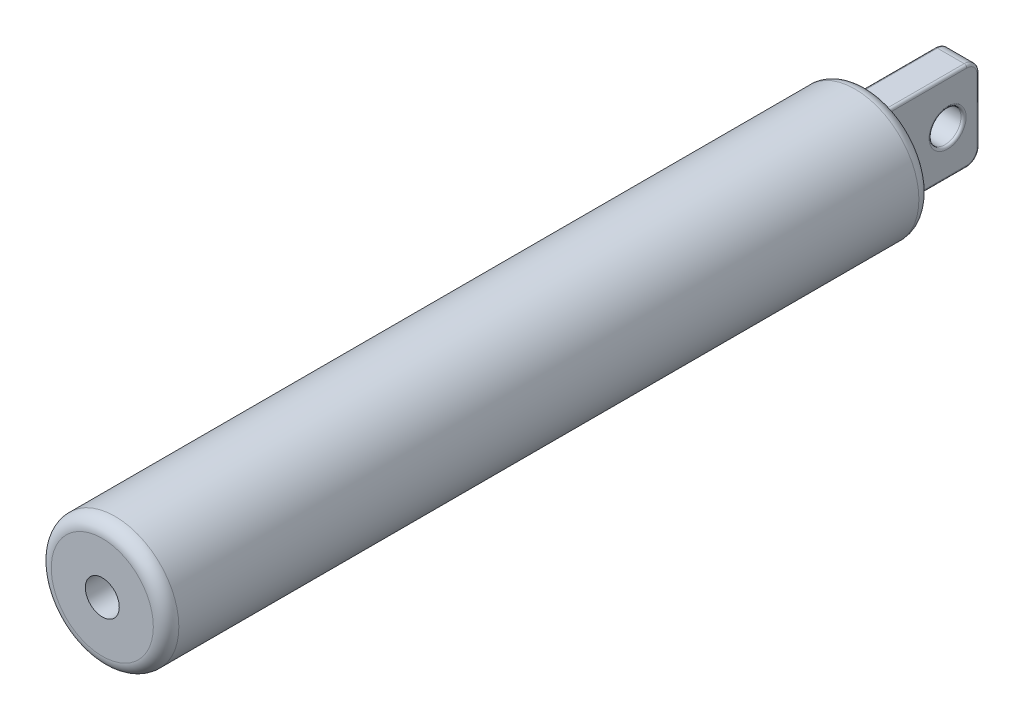
ISO-10303-21;
HEADER;
FILE_DESCRIPTION(('STEP AP214'),'2;1');
FILE_NAME('part.step','',(''),(''),'','','');
FILE_SCHEMA(('AUTOMOTIVE_DESIGN { 1 0 10303 214 1 1 1 1 }'));
ENDSEC;
DATA;
#1=APPLICATION_CONTEXT('core data for automotive mechanical design processes');
#2=APPLICATION_PROTOCOL_DEFINITION('international standard','automotive_design',2000,#1);
#3=PRODUCT_CONTEXT('',#1,'mechanical');
#4=PRODUCT('Part','Part','',(#3));
#5=PRODUCT_RELATED_PRODUCT_CATEGORY('part','',(#4));
#6=PRODUCT_DEFINITION_FORMATION('','',#4);
#7=PRODUCT_DEFINITION_CONTEXT('part definition',#1,'design');
#8=PRODUCT_DEFINITION('design','',#6,#7);
#9=PRODUCT_DEFINITION_SHAPE('','',#8);
#10=(LENGTH_UNIT() NAMED_UNIT(*) SI_UNIT(.MILLI.,.METRE.));
#11=(NAMED_UNIT(*) PLANE_ANGLE_UNIT() SI_UNIT($,.RADIAN.));
#12=(NAMED_UNIT(*) SI_UNIT($,.STERADIAN.) SOLID_ANGLE_UNIT());
#13=UNCERTAINTY_MEASURE_WITH_UNIT(LENGTH_MEASURE(1.E-05),#10,'distance_accuracy_value','');
#14=(GEOMETRIC_REPRESENTATION_CONTEXT(3) GLOBAL_UNCERTAINTY_ASSIGNED_CONTEXT((#13)) GLOBAL_UNIT_ASSIGNED_CONTEXT((#10,
#11,#12)) REPRESENTATION_CONTEXT('',''));
#15=CARTESIAN_POINT('',(0.,0.,0.));
#16=DIRECTION('',(0.,0.,1.));
#17=DIRECTION('',(1.,0.,0.));
#18=AXIS2_PLACEMENT_3D('',#15,#16,#17);
#19=CARTESIAN_POINT('',(0.,0.,0.));
#20=DIRECTION('',(0.,0.,1.));
#21=DIRECTION('',(1.,0.,0.));
#22=AXIS2_PLACEMENT_3D('',#19,#20,#21);
#23=PLANE('',#22);
#24=CARTESIAN_POINT('',(0.,0.,0.));
#25=DIRECTION('',(0.,0.,1.));
#26=DIRECTION('',(1.,0.,0.));
#27=AXIS2_PLACEMENT_3D('',#24,#25,#26);
#28=CIRCLE('',#27,10.16);
#29=CARTESIAN_POINT('',(10.16,0.,0.));
#30=VERTEX_POINT('',#29);
#31=EDGE_CURVE('E182',#30,#30,#28,.F.);
#32=ORIENTED_EDGE('',*,*,#31,.T.);
#33=EDGE_LOOP('',(#32));
#34=FACE_BOUND('',#33,.T.);
#35=CARTESIAN_POINT('',(-2.667,8.382,0.));
#36=DIRECTION('',(0.,0.,1.));
#37=DIRECTION('',(1.,0.,0.));
#38=AXIS2_PLACEMENT_3D('',#35,#36,#37);
#39=CIRCLE('',#38,1.016);
#40=CARTESIAN_POINT('',(-3.683,8.382,0.));
#41=VERTEX_POINT('',#40);
#42=CARTESIAN_POINT('',(-2.667,9.398,0.));
#43=VERTEX_POINT('',#42);
#44=EDGE_CURVE('E210',#41,#43,#39,.F.);
#45=ORIENTED_EDGE('',*,*,#44,.F.);
#46=DIRECTION('',(0.,1.,0.));
#47=VECTOR('',#46,1.);
#48=CARTESIAN_POINT('',(-3.683,-8.89,0.));
#49=LINE('',#48,#47);
#50=CARTESIAN_POINT('',(-3.683,-8.382,0.));
#51=VERTEX_POINT('',#50);
#52=EDGE_CURVE('E208',#41,#51,#49,.F.);
#53=ORIENTED_EDGE('',*,*,#52,.T.);
#54=CARTESIAN_POINT('',(-2.667,-8.382,0.));
#55=DIRECTION('',(0.,0.,1.));
#56=DIRECTION('',(1.,0.,0.));
#57=AXIS2_PLACEMENT_3D('',#54,#55,#56);
#58=CIRCLE('',#57,1.016);
#59=CARTESIAN_POINT('',(-2.667,-9.398,0.));
#60=VERTEX_POINT('',#59);
#61=EDGE_CURVE('E205',#60,#51,#58,.F.);
#62=ORIENTED_EDGE('',*,*,#61,.F.);
#63=DIRECTION('',(-1.,0.,0.));
#64=VECTOR('',#63,1.);
#65=CARTESIAN_POINT('',(3.175,-9.398,0.));
#66=LINE('',#65,#64);
#67=CARTESIAN_POINT('',(2.667,-9.398,0.));
#68=VERTEX_POINT('',#67);
#69=EDGE_CURVE('E200',#60,#68,#66,.F.);
#70=ORIENTED_EDGE('',*,*,#69,.T.);
#71=CARTESIAN_POINT('',(2.667,-8.382,0.));
#72=DIRECTION('',(0.,0.,1.));
#73=DIRECTION('',(1.,0.,0.));
#74=AXIS2_PLACEMENT_3D('',#71,#72,#73);
#75=CIRCLE('',#74,1.016);
#76=CARTESIAN_POINT('',(3.683,-8.382,0.));
#77=VERTEX_POINT('',#76);
#78=EDGE_CURVE('E197',#77,#68,#75,.F.);
#79=ORIENTED_EDGE('',*,*,#78,.F.);
#80=DIRECTION('',(0.,-1.,0.));
#81=VECTOR('',#80,1.);
#82=CARTESIAN_POINT('',(3.683,8.89,0.));
#83=LINE('',#82,#81);
#84=CARTESIAN_POINT('',(3.683,8.382,0.));
#85=VERTEX_POINT('',#84);
#86=EDGE_CURVE('E195',#77,#85,#83,.F.);
#87=ORIENTED_EDGE('',*,*,#86,.T.);
#88=CARTESIAN_POINT('',(2.667,8.382,0.));
#89=DIRECTION('',(0.,0.,1.));
#90=DIRECTION('',(1.,0.,0.));
#91=AXIS2_PLACEMENT_3D('',#88,#89,#90);
#92=CIRCLE('',#91,1.016);
#93=CARTESIAN_POINT('',(2.667,9.398,0.));
#94=VERTEX_POINT('',#93);
#95=EDGE_CURVE('E192',#94,#85,#92,.F.);
#96=ORIENTED_EDGE('',*,*,#95,.F.);
#97=DIRECTION('',(1.,0.,0.));
#98=VECTOR('',#97,1.);
#99=CARTESIAN_POINT('',(-3.175,9.398,0.));
#100=LINE('',#99,#98);
#101=EDGE_CURVE('E202',#94,#43,#100,.F.);
#102=ORIENTED_EDGE('',*,*,#101,.T.);
#103=EDGE_LOOP('',(#45,#53,#62,#70,#79,#87,#96,#102));
#104=FACE_BOUND('',#103,.T.);
#105=ADVANCED_FACE('F32',(#34,#104),#23,.F.);
#106=CARTESIAN_POINT('',(0.,0.,152.4));
#107=DIRECTION('',(0.,0.,-1.));
#108=DIRECTION('',(-1.,0.,0.));
#109=AXIS2_PLACEMENT_3D('',#106,#107,#108);
#110=CYLINDRICAL_SURFACE('',#109,12.7);
#111=CARTESIAN_POINT('',(0.,0.,2.53999999999996));
#112=DIRECTION('',(0.,0.,1.));
#113=DIRECTION('',(1.,0.,0.));
#114=AXIS2_PLACEMENT_3D('',#111,#112,#113);
#115=CIRCLE('',#114,12.7);
#116=CARTESIAN_POINT('',(-12.7,0.,2.53999999999993));
#117=VERTEX_POINT('',#116);
#118=EDGE_CURVE('E179',#117,#117,#115,.T.);
#119=CARTESIAN_POINT('',(0.,0.,149.86));
#120=DIRECTION('',(0.,0.,1.));
#121=DIRECTION('',(1.,0.,0.));
#122=AXIS2_PLACEMENT_3D('',#119,#120,#121);
#123=CIRCLE('',#122,12.7);
#124=CARTESIAN_POINT('',(-12.7,0.,149.86));
#125=VERTEX_POINT('',#124);
#126=EDGE_CURVE('E160',#125,#125,#123,.F.);
#127=CARTESIAN_POINT('',(-12.7,0.,2.53999999999993));
#128=CARTESIAN_POINT('',(-12.7,0.,4.07458333333327));
#129=CARTESIAN_POINT('',(-12.7,0.,5.60916666666661));
#130=CARTESIAN_POINT('',(-12.7,0.,8.67833333333328));
#131=CARTESIAN_POINT('',(-12.7,0.,10.2129166666666));
#132=CARTESIAN_POINT('',(-12.7,0.,13.2820833333333));
#133=CARTESIAN_POINT('',(-12.7,0.,14.8166666666666));
#134=CARTESIAN_POINT('',(-12.7,0.,17.8858333333333));
#135=CARTESIAN_POINT('',(-12.7,0.,19.4204166666666));
#136=CARTESIAN_POINT('',(-12.7,0.,22.4895833333333));
#137=CARTESIAN_POINT('',(-12.7,0.,24.0241666666666));
#138=CARTESIAN_POINT('',(-12.7,0.,27.0933333333333));
#139=CARTESIAN_POINT('',(-12.7,0.,28.6279166666666));
#140=CARTESIAN_POINT('',(-12.7,0.,31.6970833333333));
#141=CARTESIAN_POINT('',(-12.7,0.,33.2316666666666));
#142=CARTESIAN_POINT('',(-12.7,0.,36.3008333333333));
#143=CARTESIAN_POINT('',(-12.7,0.,37.8354166666666));
#144=CARTESIAN_POINT('',(-12.7,0.,40.9045833333333));
#145=CARTESIAN_POINT('',(-12.7,0.,42.4391666666666));
#146=CARTESIAN_POINT('',(-12.7,0.,45.5083333333333));
#147=CARTESIAN_POINT('',(-12.7,0.,47.0429166666666));
#148=CARTESIAN_POINT('',(-12.7,0.,50.1120833333333));
#149=CARTESIAN_POINT('',(-12.7,0.,51.6466666666666));
#150=CARTESIAN_POINT('',(-12.7,0.,54.7158333333333));
#151=CARTESIAN_POINT('',(-12.7,0.,56.2504166666666));
#152=CARTESIAN_POINT('',(-12.7,0.,59.3195833333333));
#153=CARTESIAN_POINT('',(-12.7,0.,60.8541666666666));
#154=CARTESIAN_POINT('',(-12.7,0.,63.9233333333333));
#155=CARTESIAN_POINT('',(-12.7,0.,65.4579166666666));
#156=CARTESIAN_POINT('',(-12.7,0.,68.5270833333333));
#157=CARTESIAN_POINT('',(-12.7,0.,70.0616666666666));
#158=CARTESIAN_POINT('',(-12.7,0.,73.1308333333333));
#159=CARTESIAN_POINT('',(-12.7,0.,74.6654166666666));
#160=CARTESIAN_POINT('',(-12.7,0.,77.7345833333333));
#161=CARTESIAN_POINT('',(-12.7,0.,79.2691666666666));
#162=CARTESIAN_POINT('',(-12.7,0.,82.3383333333333));
#163=CARTESIAN_POINT('',(-12.7,0.,83.8729166666666));
#164=CARTESIAN_POINT('',(-12.7,0.,86.9420833333333));
#165=CARTESIAN_POINT('',(-12.7,0.,88.4766666666666));
#166=CARTESIAN_POINT('',(-12.7,0.,91.5458333333333));
#167=CARTESIAN_POINT('',(-12.7,0.,93.0804166666667));
#168=CARTESIAN_POINT('',(-12.7,0.,96.1495833333333));
#169=CARTESIAN_POINT('',(-12.7,0.,97.6841666666667));
#170=CARTESIAN_POINT('',(-12.7,0.,100.753333333333));
#171=CARTESIAN_POINT('',(-12.7,0.,102.287916666667));
#172=CARTESIAN_POINT('',(-12.7,0.,105.357083333333));
#173=CARTESIAN_POINT('',(-12.7,0.,106.891666666667));
#174=CARTESIAN_POINT('',(-12.7,0.,109.960833333333));
#175=CARTESIAN_POINT('',(-12.7,0.,111.495416666667));
#176=CARTESIAN_POINT('',(-12.7,0.,114.564583333333));
#177=CARTESIAN_POINT('',(-12.7,0.,116.099166666667));
#178=CARTESIAN_POINT('',(-12.7,0.,119.168333333333));
#179=CARTESIAN_POINT('',(-12.7,0.,120.702916666667));
#180=CARTESIAN_POINT('',(-12.7,0.,123.772083333333));
#181=CARTESIAN_POINT('',(-12.7,0.,125.306666666667));
#182=CARTESIAN_POINT('',(-12.7,0.,128.375833333333));
#183=CARTESIAN_POINT('',(-12.7,0.,129.910416666667));
#184=CARTESIAN_POINT('',(-12.7,0.,132.979583333333));
#185=CARTESIAN_POINT('',(-12.7,0.,134.514166666667));
#186=CARTESIAN_POINT('',(-12.7,0.,137.583333333333));
#187=CARTESIAN_POINT('',(-12.7,0.,139.117916666667));
#188=CARTESIAN_POINT('',(-12.7,0.,142.187083333333));
#189=CARTESIAN_POINT('',(-12.7,0.,143.721666666667));
#190=CARTESIAN_POINT('',(-12.7,0.,146.790833333333));
#191=CARTESIAN_POINT('',(-12.7,0.,148.325416666667));
#192=CARTESIAN_POINT('',(-12.7,0.,149.86));
#193=B_SPLINE_CURVE_WITH_KNOTS('',3,(#127,#128,#129,#130,#131,#132,#133,#134,#135,#136,#137,
#138,#139,#140,#141,#142,#143,#144,#145,#146,#147,#148,#149,#150,#151,#152,#153,#154,#155,#156,
#157,#158,#159,#160,#161,#162,#163,#164,#165,#166,#167,#168,#169,#170,#171,#172,#173,#174,#175,
#176,#177,#178,#179,#180,#181,#182,#183,#184,#185,#186,#187,#188,#189,#190,#191,#192),
.UNSPECIFIED.,.F.,.F.,(4,2,2,2,2,2,2,2,2,2,2,2,2,2,2,2,2,2,2,2,2,2,2,2,2,2,2,2,2,2,2,2,4),(0.,
4.60375000000002,9.20750000000001,13.81125,18.415,23.01875,27.6225,32.22625,36.83,41.43375,
46.0375,50.64125,55.245,59.84875,64.4525,69.05625,73.66,78.26375,82.8675,87.4712500000001,
92.075,96.6787500000001,101.2825,105.88625,110.49,115.09375,119.6975,124.30125,128.905,
133.50875,138.1125,142.71625,147.32),.UNSPECIFIED.);
#194=EDGE_CURVE('BSEAM411',#117,#125,#193,.T.);
#195=ORIENTED_EDGE('',*,*,#118,.T.);
#196=ORIENTED_EDGE('',*,*,#126,.T.);
#197=ORIENTED_EDGE('',*,*,#194,.T.);
#198=ORIENTED_EDGE('',*,*,#194,.F.);
#199=EDGE_LOOP('',(#195,#197,#196,#198));
#200=FACE_BOUND('',#199,.T.);
#201=ADVANCED_FACE('F411',(#200),#110,.T.);
#202=CARTESIAN_POINT('',(0.,0.,152.4));
#203=DIRECTION('',(0.,0.,1.));
#204=DIRECTION('',(1.,0.,0.));
#205=AXIS2_PLACEMENT_3D('',#202,#203,#204);
#206=PLANE('',#205);
#207=CARTESIAN_POINT('',(0.,0.,152.4));
#208=DIRECTION('',(0.,0.,1.));
#209=DIRECTION('',(1.,0.,0.));
#210=AXIS2_PLACEMENT_3D('',#207,#208,#209);
#211=CIRCLE('',#210,10.16);
#212=CARTESIAN_POINT('',(10.16,0.,152.4));
#213=VERTEX_POINT('',#212);
#214=EDGE_CURVE('E156',#213,#213,#211,.T.);
#215=ORIENTED_EDGE('',*,*,#214,.T.);
#216=EDGE_LOOP('',(#215));
#217=FACE_BOUND('',#216,.T.);
#218=CARTESIAN_POINT('',(0.,0.,152.4));
#219=DIRECTION('',(0.,0.,1.));
#220=DIRECTION('',(1.,0.,0.));
#221=AXIS2_PLACEMENT_3D('',#218,#219,#220);
#222=CIRCLE('',#221,3.37819999999999);
#223=CARTESIAN_POINT('',(3.37819999999999,0.,152.4));
#224=VERTEX_POINT('',#223);
#225=EDGE_CURVE('E157',#224,#224,#222,.T.);
#226=ORIENTED_EDGE('',*,*,#225,.F.);
#227=EDGE_LOOP('',(#226));
#228=FACE_BOUND('',#227,.T.);
#229=ADVANCED_FACE('F150',(#217,#228),#206,.T.);
#230=CARTESIAN_POINT('',(0.,0.,3.17500000000001));
#231=DIRECTION('',(0.,0.,1.));
#232=DIRECTION('',(1.,0.,0.));
#233=AXIS2_PLACEMENT_3D('',#230,#231,#232);
#234=CONICAL_SURFACE('',#233,3.37819999999996,1.02974425867665);
#235=CARTESIAN_POINT('',(0.,0.,1.14517265680111));
#236=VERTEX_POINT('',#235);
#237=VERTEX_LOOP('',#236);
#238=FACE_BOUND('',#237,.T.);
#239=CARTESIAN_POINT('',(0.,0.,3.17500000000001));
#240=DIRECTION('',(0.,0.,1.));
#241=DIRECTION('',(1.,0.,0.));
#242=AXIS2_PLACEMENT_3D('',#239,#240,#241);
#243=CIRCLE('',#242,3.37819999999996);
#244=CARTESIAN_POINT('',(3.37819999999996,0.,3.17500000000001));
#245=VERTEX_POINT('',#244);
#246=EDGE_CURVE('E154',#245,#245,#243,.T.);
#247=ORIENTED_EDGE('',*,*,#246,.T.);
#248=EDGE_LOOP('',(#247));
#249=FACE_BOUND('',#248,.T.);
#250=ADVANCED_FACE('F146',(#238,#249),#234,.F.);
#251=CARTESIAN_POINT('',(0.,0.,152.4));
#252=DIRECTION('',(0.,0.,1.));
#253=DIRECTION('',(1.,0.,0.));
#254=AXIS2_PLACEMENT_3D('',#251,#252,#253);
#255=CYLINDRICAL_SURFACE('',#254,3.37819999999998);
#256=ORIENTED_EDGE('',*,*,#246,.F.);
#257=EDGE_LOOP('',(#256));
#258=FACE_BOUND('',#257,.T.);
#259=ORIENTED_EDGE('',*,*,#225,.T.);
#260=EDGE_LOOP('',(#259));
#261=FACE_BOUND('',#260,.T.);
#262=ADVANCED_FACE('F149',(#258,#261),#255,.F.);
#263=CARTESIAN_POINT('',(-3.175,-8.89,-19.05));
#264=DIRECTION('',(1.,0.,0.));
#265=DIRECTION('',(0.,0.,-1.));
#266=AXIS2_PLACEMENT_3D('',#263,#264,#265);
#267=PLANE('',#266);
#268=DIRECTION('',(0.,0.,1.));
#269=VECTOR('',#268,1.);
#270=CARTESIAN_POINT('',(-3.175,8.382,-19.05));
#271=LINE('',#270,#269);
#272=CARTESIAN_POINT('',(-3.175,8.382,-0.508000000000002));
#273=VERTEX_POINT('',#272);
#274=CARTESIAN_POINT('',(-3.175,8.382,-16.51));
#275=VERTEX_POINT('',#274);
#276=EDGE_CURVE('E230',#273,#275,#271,.F.);
#277=ORIENTED_EDGE('',*,*,#276,.T.);
#278=CARTESIAN_POINT('',(-3.175,6.35,-16.51));
#279=DIRECTION('',(1.,0.,0.));
#280=DIRECTION('',(0.,0.,-1.));
#281=AXIS2_PLACEMENT_3D('',#278,#279,#280);
#282=CIRCLE('',#281,2.032);
#283=CARTESIAN_POINT('',(-3.175,6.35,-18.542));
#284=VERTEX_POINT('',#283);
#285=EDGE_CURVE('E232',#275,#284,#282,.F.);
#286=ORIENTED_EDGE('',*,*,#285,.T.);
#287=DIRECTION('',(0.,1.,0.));
#288=VECTOR('',#287,1.);
#289=CARTESIAN_POINT('',(-3.175,-8.89,-18.542));
#290=LINE('',#289,#288);
#291=CARTESIAN_POINT('',(-3.175,-6.35,-18.542));
#292=VERTEX_POINT('',#291);
#293=EDGE_CURVE('E222',#284,#292,#290,.F.);
#294=ORIENTED_EDGE('',*,*,#293,.T.);
#295=CARTESIAN_POINT('',(-3.175,-6.35,-16.51));
#296=DIRECTION('',(1.,0.,0.));
#297=DIRECTION('',(0.,0.,-1.));
#298=AXIS2_PLACEMENT_3D('',#295,#296,#297);
#299=CIRCLE('',#298,2.032);
#300=CARTESIAN_POINT('',(-3.175,-8.382,-16.51));
#301=VERTEX_POINT('',#300);
#302=EDGE_CURVE('E224',#292,#301,#299,.F.);
#303=ORIENTED_EDGE('',*,*,#302,.T.);
#304=DIRECTION('',(0.,0.,1.));
#305=VECTOR('',#304,1.);
#306=CARTESIAN_POINT('',(-3.175,-8.382,-19.05));
#307=LINE('',#306,#305);
#308=CARTESIAN_POINT('',(-3.175,-8.382,-0.508000000000002));
#309=VERTEX_POINT('',#308);
#310=EDGE_CURVE('E226',#301,#309,#307,.T.);
#311=ORIENTED_EDGE('',*,*,#310,.T.);
#312=DIRECTION('',(0.,1.,0.));
#313=VECTOR('',#312,1.);
#314=CARTESIAN_POINT('',(-3.175,8.89,-0.508000000000002));
#315=LINE('',#314,#313);
#316=EDGE_CURVE('E228',#309,#273,#315,.T.);
#317=ORIENTED_EDGE('',*,*,#316,.T.);
#318=EDGE_LOOP('',(#277,#286,#294,#303,#311,#317));
#319=FACE_BOUND('',#318,.T.);
#320=CARTESIAN_POINT('',(-3.175,0.,-12.7));
#321=DIRECTION('',(1.,0.,0.));
#322=DIRECTION('',(0.,0.,-1.));
#323=AXIS2_PLACEMENT_3D('',#320,#321,#322);
#324=CIRCLE('',#323,3.683);
#325=CARTESIAN_POINT('',(-3.175,0.,-16.383));
#326=VERTEX_POINT('',#325);
#327=EDGE_CURVE('E219',#326,#326,#324,.T.);
#328=ORIENTED_EDGE('',*,*,#327,.T.);
#329=EDGE_LOOP('',(#328));
#330=FACE_BOUND('',#329,.T.);
#331=ADVANCED_FACE('F388',(#319,#330),#267,.F.);
#332=CARTESIAN_POINT('',(3.175,8.89,-19.05));
#333=DIRECTION('',(0.,-1.,0.));
#334=DIRECTION('',(0.,0.,-1.));
#335=AXIS2_PLACEMENT_3D('',#332,#333,#334);
#336=PLANE('',#335);
#337=DIRECTION('',(1.,0.,0.));
#338=VECTOR('',#337,1.);
#339=CARTESIAN_POINT('',(3.175,8.89,-16.51));
#340=LINE('',#339,#338);
#341=CARTESIAN_POINT('',(2.667,8.89,-16.51));
#342=VERTEX_POINT('',#341);
#343=CARTESIAN_POINT('',(-2.667,8.89,-16.51));
#344=VERTEX_POINT('',#343);
#345=EDGE_CURVE('E176',#342,#344,#340,.F.);
#346=ORIENTED_EDGE('',*,*,#345,.T.);
#347=DIRECTION('',(0.,0.,1.));
#348=VECTOR('',#347,1.);
#349=CARTESIAN_POINT('',(-2.667,8.89,-19.05));
#350=LINE('',#349,#348);
#351=CARTESIAN_POINT('',(-2.667,8.89,-0.508000000000002));
#352=VERTEX_POINT('',#351);
#353=EDGE_CURVE('E190',#344,#352,#350,.T.);
#354=ORIENTED_EDGE('',*,*,#353,.T.);
#355=DIRECTION('',(1.,0.,0.));
#356=VECTOR('',#355,1.);
#357=CARTESIAN_POINT('',(3.175,8.89,-0.508000000000002));
#358=LINE('',#357,#356);
#359=CARTESIAN_POINT('',(2.667,8.89,-0.508000000000002));
#360=VERTEX_POINT('',#359);
#361=EDGE_CURVE('E187',#352,#360,#358,.T.);
#362=ORIENTED_EDGE('',*,*,#361,.T.);
#363=DIRECTION('',(0.,0.,1.));
#364=VECTOR('',#363,1.);
#365=CARTESIAN_POINT('',(2.667,8.89,-19.05));
#366=LINE('',#365,#364);
#367=EDGE_CURVE('E185',#360,#342,#366,.F.);
#368=ORIENTED_EDGE('',*,*,#367,.T.);
#369=EDGE_LOOP('',(#346,#354,#362,#368));
#370=FACE_BOUND('',#369,.T.);
#371=ADVANCED_FACE('F647',(#370),#336,.F.);
#372=CARTESIAN_POINT('',(3.175,-8.89,-19.05));
#373=DIRECTION('',(-1.,0.,0.));
#374=DIRECTION('',(0.,0.,1.));
#375=AXIS2_PLACEMENT_3D('',#372,#373,#374);
#376=PLANE('',#375);
#377=DIRECTION('',(0.,0.,1.));
#378=VECTOR('',#377,1.);
#379=CARTESIAN_POINT('',(3.175,8.382,-19.05));
#380=LINE('',#379,#378);
#381=CARTESIAN_POINT('',(3.175,8.382,-16.51));
#382=VERTEX_POINT('',#381);
#383=CARTESIAN_POINT('',(3.175,8.382,-0.508000000000002));
#384=VERTEX_POINT('',#383);
#385=EDGE_CURVE('E41',#382,#384,#380,.T.);
#386=ORIENTED_EDGE('',*,*,#385,.T.);
#387=DIRECTION('',(0.,-1.,0.));
#388=VECTOR('',#387,1.);
#389=CARTESIAN_POINT('',(3.175,-8.89,-0.508000000000002));
#390=LINE('',#389,#388);
#391=CARTESIAN_POINT('',(3.175,-8.382,-0.508000000000002));
#392=VERTEX_POINT('',#391);
#393=EDGE_CURVE('E11',#384,#392,#390,.T.);
#394=ORIENTED_EDGE('',*,*,#393,.T.);
#395=DIRECTION('',(0.,0.,1.));
#396=VECTOR('',#395,1.);
#397=CARTESIAN_POINT('',(3.175,-8.382,-19.05));
#398=LINE('',#397,#396);
#399=CARTESIAN_POINT('',(3.175,-8.382,-16.51));
#400=VERTEX_POINT('',#399);
#401=EDGE_CURVE('E256',#392,#400,#398,.F.);
#402=ORIENTED_EDGE('',*,*,#401,.T.);
#403=CARTESIAN_POINT('',(3.175,-6.35,-16.51));
#404=DIRECTION('',(-1.,0.,0.));
#405=DIRECTION('',(0.,0.,1.));
#406=AXIS2_PLACEMENT_3D('',#403,#404,#405);
#407=CIRCLE('',#406,2.032);
#408=CARTESIAN_POINT('',(3.175,-6.35,-18.542));
#409=VERTEX_POINT('',#408);
#410=EDGE_CURVE('E258',#400,#409,#407,.F.);
#411=ORIENTED_EDGE('',*,*,#410,.T.);
#412=DIRECTION('',(0.,-1.,0.));
#413=VECTOR('',#412,1.);
#414=CARTESIAN_POINT('',(3.175,-8.89,-18.542));
#415=LINE('',#414,#413);
#416=CARTESIAN_POINT('',(3.175,6.35,-18.542));
#417=VERTEX_POINT('',#416);
#418=EDGE_CURVE('E260',#409,#417,#415,.F.);
#419=ORIENTED_EDGE('',*,*,#418,.T.);
#420=CARTESIAN_POINT('',(3.175,6.35,-16.51));
#421=DIRECTION('',(-1.,0.,0.));
#422=DIRECTION('',(0.,0.,1.));
#423=AXIS2_PLACEMENT_3D('',#420,#421,#422);
#424=CIRCLE('',#423,2.032);
#425=EDGE_CURVE('E52',#417,#382,#424,.F.);
#426=ORIENTED_EDGE('',*,*,#425,.T.);
#427=EDGE_LOOP('',(#386,#394,#402,#411,#419,#426));
#428=FACE_BOUND('',#427,.T.);
#429=CARTESIAN_POINT('',(3.175,0.,-12.7));
#430=DIRECTION('',(-1.,0.,0.));
#431=DIRECTION('',(0.,0.,1.));
#432=AXIS2_PLACEMENT_3D('',#429,#430,#431);
#433=CIRCLE('',#432,3.683);
#434=CARTESIAN_POINT('',(3.175,0.,-9.017));
#435=VERTEX_POINT('',#434);
#436=EDGE_CURVE('E253',#435,#435,#433,.T.);
#437=ORIENTED_EDGE('',*,*,#436,.T.);
#438=EDGE_LOOP('',(#437));
#439=FACE_BOUND('',#438,.T.);
#440=ADVANCED_FACE('F360',(#428,#439),#376,.F.);
#441=CARTESIAN_POINT('',(3.175,-8.89,-19.05));
#442=DIRECTION('',(0.,1.,0.));
#443=DIRECTION('',(0.,0.,1.));
#444=AXIS2_PLACEMENT_3D('',#441,#442,#443);
#445=PLANE('',#444);
#446=DIRECTION('',(-1.,0.,0.));
#447=VECTOR('',#446,1.);
#448=CARTESIAN_POINT('',(-3.175,-8.89,-0.508000000000002));
#449=LINE('',#448,#447);
#450=CARTESIAN_POINT('',(2.667,-8.89,-0.508000000000002));
#451=VERTEX_POINT('',#450);
#452=CARTESIAN_POINT('',(-2.667,-8.89,-0.508000000000002));
#453=VERTEX_POINT('',#452);
#454=EDGE_CURVE('E215',#451,#453,#449,.T.);
#455=ORIENTED_EDGE('',*,*,#454,.T.);
#456=DIRECTION('',(0.,0.,1.));
#457=VECTOR('',#456,1.);
#458=CARTESIAN_POINT('',(-2.667,-8.89,-19.05));
#459=LINE('',#458,#457);
#460=CARTESIAN_POINT('',(-2.667,-8.89,-16.51));
#461=VERTEX_POINT('',#460);
#462=EDGE_CURVE('E217',#453,#461,#459,.F.);
#463=ORIENTED_EDGE('',*,*,#462,.T.);
#464=DIRECTION('',(-1.,0.,0.));
#465=VECTOR('',#464,1.);
#466=CARTESIAN_POINT('',(3.175,-8.89,-16.51));
#467=LINE('',#466,#465);
#468=CARTESIAN_POINT('',(2.667,-8.89,-16.51));
#469=VERTEX_POINT('',#468);
#470=EDGE_CURVE('E173',#461,#469,#467,.F.);
#471=ORIENTED_EDGE('',*,*,#470,.T.);
#472=DIRECTION('',(0.,0.,1.));
#473=VECTOR('',#472,1.);
#474=CARTESIAN_POINT('',(2.667,-8.89,-19.05));
#475=LINE('',#474,#473);
#476=EDGE_CURVE('E213',#469,#451,#475,.T.);
#477=ORIENTED_EDGE('',*,*,#476,.T.);
#478=EDGE_LOOP('',(#455,#463,#471,#477));
#479=FACE_BOUND('',#478,.T.);
#480=ADVANCED_FACE('F373',(#479),#445,.F.);
#481=CARTESIAN_POINT('',(-3.175,8.89,-19.05));
#482=DIRECTION('',(0.,0.,1.));
#483=DIRECTION('',(1.,0.,0.));
#484=AXIS2_PLACEMENT_3D('',#481,#482,#483);
#485=PLANE('',#484);
#486=DIRECTION('',(-1.,0.,0.));
#487=VECTOR('',#486,1.);
#488=CARTESIAN_POINT('',(-3.175,-6.35,-19.05));
#489=LINE('',#488,#487);
#490=CARTESIAN_POINT('',(2.667,-6.35,-19.05));
#491=VERTEX_POINT('',#490);
#492=CARTESIAN_POINT('',(-2.667,-6.35,-19.05));
#493=VERTEX_POINT('',#492);
#494=EDGE_CURVE('E170',#491,#493,#489,.T.);
#495=ORIENTED_EDGE('',*,*,#494,.T.);
#496=DIRECTION('',(0.,1.,0.));
#497=VECTOR('',#496,1.);
#498=CARTESIAN_POINT('',(-2.667,8.89,-19.05));
#499=LINE('',#498,#497);
#500=CARTESIAN_POINT('',(-2.667,6.35,-19.05));
#501=VERTEX_POINT('',#500);
#502=EDGE_CURVE('E245',#493,#501,#499,.T.);
#503=ORIENTED_EDGE('',*,*,#502,.T.);
#504=DIRECTION('',(1.,0.,0.));
#505=VECTOR('',#504,1.);
#506=CARTESIAN_POINT('',(-3.175,6.35,-19.05));
#507=LINE('',#506,#505);
#508=CARTESIAN_POINT('',(2.667,6.35,-19.05));
#509=VERTEX_POINT('',#508);
#510=EDGE_CURVE('E167',#501,#509,#507,.T.);
#511=ORIENTED_EDGE('',*,*,#510,.T.);
#512=DIRECTION('',(0.,-1.,0.));
#513=VECTOR('',#512,1.);
#514=CARTESIAN_POINT('',(2.667,8.89,-19.05));
#515=LINE('',#514,#513);
#516=EDGE_CURVE('E243',#509,#491,#515,.T.);
#517=ORIENTED_EDGE('',*,*,#516,.T.);
#518=EDGE_LOOP('',(#495,#503,#511,#517));
#519=FACE_BOUND('',#518,.T.);
#520=ADVANCED_FACE('F337',(#519),#485,.F.);
#521=CARTESIAN_POINT('',(-12.7,0.,-12.7));
#522=DIRECTION('',(1.,0.,0.));
#523=DIRECTION('',(0.,0.,-1.));
#524=AXIS2_PLACEMENT_3D('',#521,#522,#523);
#525=CYLINDRICAL_SURFACE('',#524,3.17500000000001);
#526=CARTESIAN_POINT('',(-2.667,0.,-12.7));
#527=DIRECTION('',(1.,0.,0.));
#528=DIRECTION('',(0.,0.,-1.));
#529=AXIS2_PLACEMENT_3D('',#526,#527,#528);
#530=CIRCLE('',#529,3.17500000000001);
#531=CARTESIAN_POINT('',(-2.667,0.,-15.875));
#532=VERTEX_POINT('',#531);
#533=EDGE_CURVE('E250',#532,#532,#530,.F.);
#534=CARTESIAN_POINT('',(2.667,0.,-12.7));
#535=DIRECTION('',(-1.,0.,0.));
#536=DIRECTION('',(0.,0.,1.));
#537=AXIS2_PLACEMENT_3D('',#534,#535,#536);
#538=CIRCLE('',#537,3.17500000000001);
#539=CARTESIAN_POINT('',(2.667,0.,-15.875));
#540=VERTEX_POINT('',#539);
#541=EDGE_CURVE('E247',#540,#540,#538,.F.);
#542=CARTESIAN_POINT('',(-2.667,0.,-15.875));
#543=CARTESIAN_POINT('',(-2.6114375,0.,-15.875));
#544=CARTESIAN_POINT('',(-2.555875,0.,-15.875));
#545=CARTESIAN_POINT('',(-2.44475,0.,-15.875));
#546=CARTESIAN_POINT('',(-2.3891875,0.,-15.875));
#547=CARTESIAN_POINT('',(-2.2780625,0.,-15.875));
#548=CARTESIAN_POINT('',(-2.2225,0.,-15.875));
#549=CARTESIAN_POINT('',(-2.111375,0.,-15.875));
#550=CARTESIAN_POINT('',(-2.0558125,0.,-15.875));
#551=CARTESIAN_POINT('',(-1.9446875,0.,-15.875));
#552=CARTESIAN_POINT('',(-1.889125,0.,-15.875));
#553=CARTESIAN_POINT('',(-1.778,0.,-15.875));
#554=CARTESIAN_POINT('',(-1.7224375,0.,-15.875));
#555=CARTESIAN_POINT('',(-1.6113125,0.,-15.875));
#556=CARTESIAN_POINT('',(-1.55575,0.,-15.875));
#557=CARTESIAN_POINT('',(-1.444625,0.,-15.875));
#558=CARTESIAN_POINT('',(-1.3890625,0.,-15.875));
#559=CARTESIAN_POINT('',(-1.2779375,0.,-15.875));
#560=CARTESIAN_POINT('',(-1.222375,0.,-15.875));
#561=CARTESIAN_POINT('',(-1.11125,0.,-15.875));
#562=CARTESIAN_POINT('',(-1.0556875,0.,-15.875));
#563=CARTESIAN_POINT('',(-0.944562499999999,0.,-15.875));
#564=CARTESIAN_POINT('',(-0.888999999999999,0.,-15.875));
#565=CARTESIAN_POINT('',(-0.777875,0.,-15.875));
#566=CARTESIAN_POINT('',(-0.7223125,0.,-15.875));
#567=CARTESIAN_POINT('',(-0.6111875,0.,-15.875));
#568=CARTESIAN_POINT('',(-0.555624999999999,0.,-15.875));
#569=CARTESIAN_POINT('',(-0.444499999999999,0.,-15.875));
#570=CARTESIAN_POINT('',(-0.3889375,0.,-15.875));
#571=CARTESIAN_POINT('',(-0.2778125,0.,-15.875));
#572=CARTESIAN_POINT('',(-0.22225,0.,-15.875));
#573=CARTESIAN_POINT('',(-0.111125,0.,-15.875));
#574=CARTESIAN_POINT('',(-0.0555625000000001,0.,-15.875));
#575=CARTESIAN_POINT('',(0.0555625000000001,0.,-15.875));
#576=CARTESIAN_POINT('',(0.111125,0.,-15.875));
#577=CARTESIAN_POINT('',(0.22225,0.,-15.875));
#578=CARTESIAN_POINT('',(0.2778125,0.,-15.875));
#579=CARTESIAN_POINT('',(0.3889375,0.,-15.875));
#580=CARTESIAN_POINT('',(0.444499999999999,0.,-15.875));
#581=CARTESIAN_POINT('',(0.555624999999999,0.,-15.875));
#582=CARTESIAN_POINT('',(0.6111875,0.,-15.875));
#583=CARTESIAN_POINT('',(0.7223125,0.,-15.875));
#584=CARTESIAN_POINT('',(0.777875,0.,-15.875));
#585=CARTESIAN_POINT('',(0.888999999999999,0.,-15.875));
#586=CARTESIAN_POINT('',(0.944562499999999,0.,-15.875));
#587=CARTESIAN_POINT('',(1.0556875,0.,-15.875));
#588=CARTESIAN_POINT('',(1.11125,0.,-15.875));
#589=CARTESIAN_POINT('',(1.222375,0.,-15.875));
#590=CARTESIAN_POINT('',(1.2779375,0.,-15.875));
#591=CARTESIAN_POINT('',(1.3890625,0.,-15.875));
#592=CARTESIAN_POINT('',(1.444625,0.,-15.875));
#593=CARTESIAN_POINT('',(1.55575,0.,-15.875));
#594=CARTESIAN_POINT('',(1.6113125,0.,-15.875));
#595=CARTESIAN_POINT('',(1.7224375,0.,-15.875));
#596=CARTESIAN_POINT('',(1.778,0.,-15.875));
#597=CARTESIAN_POINT('',(1.889125,0.,-15.875));
#598=CARTESIAN_POINT('',(1.9446875,0.,-15.875));
#599=CARTESIAN_POINT('',(2.0558125,0.,-15.875));
#600=CARTESIAN_POINT('',(2.111375,0.,-15.875));
#601=CARTESIAN_POINT('',(2.2225,0.,-15.875));
#602=CARTESIAN_POINT('',(2.2780625,0.,-15.875));
#603=CARTESIAN_POINT('',(2.3891875,0.,-15.875));
#604=CARTESIAN_POINT('',(2.44475,0.,-15.875));
#605=CARTESIAN_POINT('',(2.555875,0.,-15.875));
#606=CARTESIAN_POINT('',(2.6114375,0.,-15.875));
#607=CARTESIAN_POINT('',(2.667,0.,-15.875));
#608=B_SPLINE_CURVE_WITH_KNOTS('',3,(#542,#543,#544,#545,#546,#547,#548,#549,#550,#551,#552,
#553,#554,#555,#556,#557,#558,#559,#560,#561,#562,#563,#564,#565,#566,#567,#568,#569,#570,#571,
#572,#573,#574,#575,#576,#577,#578,#579,#580,#581,#582,#583,#584,#585,#586,#587,#588,#589,#590,
#591,#592,#593,#594,#595,#596,#597,#598,#599,#600,#601,#602,#603,#604,#605,#606,#607),
.UNSPECIFIED.,.F.,.F.,(4,2,2,2,2,2,2,2,2,2,2,2,2,2,2,2,2,2,2,2,2,2,2,2,2,2,2,2,2,2,2,2,4),(0.,
0.1666875,0.333375,0.500062500000001,0.666750000000001,0.833437499999999,1.000125,1.1668125,
1.3335,1.5001875,1.666875,1.8335625,2.00025,2.1669375,2.333625,2.5003125,2.667,2.8336875,
3.000375,3.1670625,3.33375,3.5004375,3.667125,3.8338125,4.0005,4.1671875,4.333875,4.5005625,
4.66725,4.8339375,5.000625,5.1673125,5.334),.UNSPECIFIED.);
#609=EDGE_CURVE('BSEAM425',#532,#540,#608,.T.);
#610=ORIENTED_EDGE('',*,*,#533,.T.);
#611=ORIENTED_EDGE('',*,*,#541,.T.);
#612=ORIENTED_EDGE('',*,*,#609,.T.);
#613=ORIENTED_EDGE('',*,*,#609,.F.);
#614=EDGE_LOOP('',(#610,#612,#611,#613));
#615=FACE_BOUND('',#614,.T.);
#616=ADVANCED_FACE('F425',(#615),#525,.F.);
#617=CARTESIAN_POINT('',(0.,0.,149.86));
#618=DIRECTION('',(0.,0.,1.));
#619=DIRECTION('',(1.,0.,0.));
#620=AXIS2_PLACEMENT_3D('',#617,#618,#619);
#621=TOROIDAL_SURFACE('',#620,10.16,2.54);
#622=ORIENTED_EDGE('',*,*,#126,.F.);
#623=EDGE_LOOP('',(#622));
#624=FACE_BOUND('',#623,.T.);
#625=ORIENTED_EDGE('',*,*,#214,.F.);
#626=EDGE_LOOP('',(#625));
#627=FACE_BOUND('',#626,.T.);
#628=ADVANCED_FACE('F422',(#624,#627),#621,.T.);
#629=CARTESIAN_POINT('',(-3.175,-6.35,-16.51));
#630=DIRECTION('',(-1.,0.,0.));
#631=DIRECTION('',(0.,0.,1.));
#632=AXIS2_PLACEMENT_3D('',#629,#630,#631);
#633=CYLINDRICAL_SURFACE('',#632,2.54);
#634=ORIENTED_EDGE('',*,*,#470,.F.);
#635=CARTESIAN_POINT('',(-2.667,-6.35,-16.51));
#636=DIRECTION('',(1.,0.,0.));
#637=DIRECTION('',(0.,0.,-1.));
#638=AXIS2_PLACEMENT_3D('',#635,#636,#637);
#639=CIRCLE('',#638,2.54);
#640=EDGE_CURVE('E241',#461,#493,#639,.T.);
#641=ORIENTED_EDGE('',*,*,#640,.T.);
#642=ORIENTED_EDGE('',*,*,#494,.F.);
#643=CARTESIAN_POINT('',(2.667,-6.35,-16.51));
#644=DIRECTION('',(-1.,0.,0.));
#645=DIRECTION('',(0.,0.,1.));
#646=AXIS2_PLACEMENT_3D('',#643,#644,#645);
#647=CIRCLE('',#646,2.54);
#648=EDGE_CURVE('E239',#491,#469,#647,.T.);
#649=ORIENTED_EDGE('',*,*,#648,.T.);
#650=EDGE_LOOP('',(#634,#641,#642,#649));
#651=FACE_BOUND('',#650,.T.);
#652=ADVANCED_FACE('F334',(#651),#633,.T.);
#653=CARTESIAN_POINT('',(-3.175,6.35,-16.51));
#654=DIRECTION('',(1.,0.,0.));
#655=DIRECTION('',(0.,0.,-1.));
#656=AXIS2_PLACEMENT_3D('',#653,#654,#655);
#657=CYLINDRICAL_SURFACE('',#656,2.54);
#658=ORIENTED_EDGE('',*,*,#510,.F.);
#659=CARTESIAN_POINT('',(-2.667,6.35,-16.51));
#660=DIRECTION('',(1.,0.,0.));
#661=DIRECTION('',(0.,0.,-1.));
#662=AXIS2_PLACEMENT_3D('',#659,#660,#661);
#663=CIRCLE('',#662,2.54);
#664=EDGE_CURVE('E237',#501,#344,#663,.T.);
#665=ORIENTED_EDGE('',*,*,#664,.T.);
#666=ORIENTED_EDGE('',*,*,#345,.F.);
#667=CARTESIAN_POINT('',(2.667,6.35,-16.51));
#668=DIRECTION('',(-1.,0.,0.));
#669=DIRECTION('',(0.,0.,1.));
#670=AXIS2_PLACEMENT_3D('',#667,#668,#669);
#671=CIRCLE('',#670,2.54);
#672=EDGE_CURVE('E235',#342,#509,#671,.T.);
#673=ORIENTED_EDGE('',*,*,#672,.T.);
#674=EDGE_LOOP('',(#658,#665,#666,#673));
#675=FACE_BOUND('',#674,.T.);
#676=ADVANCED_FACE('F429',(#675),#657,.T.);
#677=CARTESIAN_POINT('',(0.,0.,2.53999999999999));
#678=DIRECTION('',(0.,0.,1.));
#679=DIRECTION('',(1.,0.,0.));
#680=AXIS2_PLACEMENT_3D('',#677,#678,#679);
#681=TOROIDAL_SURFACE('',#680,10.16,2.54);
#682=ORIENTED_EDGE('',*,*,#31,.F.);
#683=EDGE_LOOP('',(#682));
#684=FACE_BOUND('',#683,.T.);
#685=ORIENTED_EDGE('',*,*,#118,.F.);
#686=EDGE_LOOP('',(#685));
#687=FACE_BOUND('',#686,.T.);
#688=ADVANCED_FACE('F432',(#684,#687),#681,.T.);
#689=CARTESIAN_POINT('',(-2.667,-6.35,-16.51));
#690=DIRECTION('',(1.,0.,0.));
#691=DIRECTION('',(0.,0.,-1.));
#692=AXIS2_PLACEMENT_3D('',#689,#690,#691);
#693=TOROIDAL_SURFACE('',#692,2.032,0.508);
#694=CARTESIAN_POINT('',(-2.667,-6.35,-18.542));
#695=DIRECTION('',(0.,1.,0.));
#696=DIRECTION('',(0.,0.,1.));
#697=AXIS2_PLACEMENT_3D('',#694,#695,#696);
#698=CIRCLE('',#697,0.508);
#699=EDGE_CURVE('E313',#493,#292,#698,.T.);
#700=ORIENTED_EDGE('',*,*,#699,.F.);
#701=ORIENTED_EDGE('',*,*,#640,.F.);
#702=CARTESIAN_POINT('',(-2.667,-8.382,-16.51));
#703=DIRECTION('',(0.,0.,1.));
#704=DIRECTION('',(1.,0.,0.));
#705=AXIS2_PLACEMENT_3D('',#702,#703,#704);
#706=CIRCLE('',#705,0.508);
#707=EDGE_CURVE('E36',#301,#461,#706,.T.);
#708=ORIENTED_EDGE('',*,*,#707,.F.);
#709=ORIENTED_EDGE('',*,*,#302,.F.);
#710=EDGE_LOOP('',(#700,#701,#708,#709));
#711=FACE_BOUND('',#710,.T.);
#712=ADVANCED_FACE('F330',(#711),#693,.T.);
#713=CARTESIAN_POINT('',(2.667,-6.35,-16.51));
#714=DIRECTION('',(-1.,0.,0.));
#715=DIRECTION('',(0.,0.,1.));
#716=AXIS2_PLACEMENT_3D('',#713,#714,#715);
#717=TOROIDAL_SURFACE('',#716,2.032,0.508);
#718=CARTESIAN_POINT('',(2.667,-8.382,-16.51));
#719=DIRECTION('',(0.,0.,1.));
#720=DIRECTION('',(1.,0.,0.));
#721=AXIS2_PLACEMENT_3D('',#718,#719,#720);
#722=CIRCLE('',#721,0.508);
#723=EDGE_CURVE('E308',#469,#400,#722,.T.);
#724=ORIENTED_EDGE('',*,*,#723,.F.);
#725=ORIENTED_EDGE('',*,*,#648,.F.);
#726=CARTESIAN_POINT('',(2.667,-6.35,-18.542));
#727=DIRECTION('',(0.,1.,0.));
#728=DIRECTION('',(0.,0.,1.));
#729=AXIS2_PLACEMENT_3D('',#726,#727,#728);
#730=CIRCLE('',#729,0.508);
#731=EDGE_CURVE('E311',#409,#491,#730,.T.);
#732=ORIENTED_EDGE('',*,*,#731,.F.);
#733=ORIENTED_EDGE('',*,*,#410,.F.);
#734=EDGE_LOOP('',(#724,#725,#732,#733));
#735=FACE_BOUND('',#734,.T.);
#736=ADVANCED_FACE('F368',(#735),#717,.T.);
#737=CARTESIAN_POINT('',(-2.667,-8.382,-19.05));
#738=DIRECTION('',(0.,0.,1.));
#739=DIRECTION('',(1.,0.,0.));
#740=AXIS2_PLACEMENT_3D('',#737,#738,#739);
#741=CYLINDRICAL_SURFACE('',#740,0.508);
#742=ORIENTED_EDGE('',*,*,#707,.T.);
#743=ORIENTED_EDGE('',*,*,#462,.F.);
#744=CARTESIAN_POINT('',(-2.667,-8.382,-0.508000000000002));
#745=DIRECTION('',(0.,0.,1.));
#746=DIRECTION('',(1.,0.,0.));
#747=AXIS2_PLACEMENT_3D('',#744,#745,#746);
#748=CIRCLE('',#747,0.508);
#749=EDGE_CURVE('E302',#309,#453,#748,.T.);
#750=ORIENTED_EDGE('',*,*,#749,.F.);
#751=ORIENTED_EDGE('',*,*,#310,.F.);
#752=EDGE_LOOP('',(#742,#743,#750,#751));
#753=FACE_BOUND('',#752,.T.);
#754=ADVANCED_FACE('F324',(#753),#741,.T.);
#755=CARTESIAN_POINT('',(-2.667,8.89,-18.542));
#756=DIRECTION('',(0.,1.,0.));
#757=DIRECTION('',(0.,0.,1.));
#758=AXIS2_PLACEMENT_3D('',#755,#756,#757);
#759=CYLINDRICAL_SURFACE('',#758,0.508);
#760=ORIENTED_EDGE('',*,*,#699,.T.);
#761=ORIENTED_EDGE('',*,*,#293,.F.);
#762=CARTESIAN_POINT('',(-2.667,6.35,-18.542));
#763=DIRECTION('',(0.,1.,0.));
#764=DIRECTION('',(0.,0.,1.));
#765=AXIS2_PLACEMENT_3D('',#762,#763,#764);
#766=CIRCLE('',#765,0.508);
#767=EDGE_CURVE('E300',#501,#284,#766,.T.);
#768=ORIENTED_EDGE('',*,*,#767,.F.);
#769=ORIENTED_EDGE('',*,*,#502,.F.);
#770=EDGE_LOOP('',(#760,#761,#768,#769));
#771=FACE_BOUND('',#770,.T.);
#772=ADVANCED_FACE('F401',(#771),#759,.T.);
#773=CARTESIAN_POINT('',(2.667,8.89,-18.542));
#774=DIRECTION('',(0.,-1.,0.));
#775=DIRECTION('',(0.,0.,-1.));
#776=AXIS2_PLACEMENT_3D('',#773,#774,#775);
#777=CYLINDRICAL_SURFACE('',#776,0.508);
#778=ORIENTED_EDGE('',*,*,#731,.T.);
#779=ORIENTED_EDGE('',*,*,#516,.F.);
#780=CARTESIAN_POINT('',(2.667,6.35,-18.542));
#781=DIRECTION('',(0.,1.,0.));
#782=DIRECTION('',(0.,0.,1.));
#783=AXIS2_PLACEMENT_3D('',#780,#781,#782);
#784=CIRCLE('',#783,0.508);
#785=EDGE_CURVE('E297',#417,#509,#784,.T.);
#786=ORIENTED_EDGE('',*,*,#785,.F.);
#787=ORIENTED_EDGE('',*,*,#418,.F.);
#788=EDGE_LOOP('',(#778,#779,#786,#787));
#789=FACE_BOUND('',#788,.T.);
#790=ADVANCED_FACE('F342',(#789),#777,.T.);
#791=CARTESIAN_POINT('',(2.667,-8.382,-19.05));
#792=DIRECTION('',(0.,0.,1.));
#793=DIRECTION('',(1.,0.,0.));
#794=AXIS2_PLACEMENT_3D('',#791,#792,#793);
#795=CYLINDRICAL_SURFACE('',#794,0.508);
#796=ORIENTED_EDGE('',*,*,#723,.T.);
#797=ORIENTED_EDGE('',*,*,#401,.F.);
#798=CARTESIAN_POINT('',(2.667,-8.382,-0.508000000000002));
#799=DIRECTION('',(0.,0.,1.));
#800=DIRECTION('',(1.,0.,0.));
#801=AXIS2_PLACEMENT_3D('',#798,#799,#800);
#802=CIRCLE('',#801,0.508);
#803=EDGE_CURVE('E294',#451,#392,#802,.T.);
#804=ORIENTED_EDGE('',*,*,#803,.F.);
#805=ORIENTED_EDGE('',*,*,#476,.F.);
#806=EDGE_LOOP('',(#796,#797,#804,#805));
#807=FACE_BOUND('',#806,.T.);
#808=ADVANCED_FACE('F370',(#807),#795,.T.);
#809=CARTESIAN_POINT('',(3.175,-9.398,-0.508000000000002));
#810=DIRECTION('',(1.,0.,0.));
#811=DIRECTION('',(0.,0.,-1.));
#812=AXIS2_PLACEMENT_3D('',#809,#810,#811);
#813=CYLINDRICAL_SURFACE('',#812,0.508);
#814=CARTESIAN_POINT('',(2.667,-9.398,-0.508));
#815=DIRECTION('',(-1.,0.,0.));
#816=DIRECTION('',(0.,0.,1.));
#817=AXIS2_PLACEMENT_3D('',#814,#815,#816);
#818=CIRCLE('',#817,0.508);
#819=EDGE_CURVE('E291',#68,#451,#818,.T.);
#820=ORIENTED_EDGE('',*,*,#819,.F.);
#821=ORIENTED_EDGE('',*,*,#69,.F.);
#822=CARTESIAN_POINT('',(-2.667,-9.398,-0.508000000000002));
#823=DIRECTION('',(1.,0.,0.));
#824=DIRECTION('',(0.,0.,-1.));
#825=AXIS2_PLACEMENT_3D('',#822,#823,#824);
#826=CIRCLE('',#825,0.508);
#827=EDGE_CURVE('E305',#453,#60,#826,.T.);
#828=ORIENTED_EDGE('',*,*,#827,.F.);
#829=ORIENTED_EDGE('',*,*,#454,.F.);
#830=EDGE_LOOP('',(#820,#821,#828,#829));
#831=FACE_BOUND('',#830,.T.);
#832=ADVANCED_FACE('F376',(#831),#813,.F.);
#833=CARTESIAN_POINT('',(-2.667,-8.382,-0.508000000000002));
#834=DIRECTION('',(0.,0.,1.));
#835=DIRECTION('',(1.,0.,0.));
#836=AXIS2_PLACEMENT_3D('',#833,#834,#835);
#837=TOROIDAL_SURFACE('',#836,1.016,0.508);
#838=ORIENTED_EDGE('',*,*,#827,.T.);
#839=ORIENTED_EDGE('',*,*,#61,.T.);
#840=CARTESIAN_POINT('',(-3.683,-8.382,-0.508));
#841=DIRECTION('',(0.,1.,0.));
#842=DIRECTION('',(0.,0.,1.));
#843=AXIS2_PLACEMENT_3D('',#840,#841,#842);
#844=CIRCLE('',#843,0.508);
#845=EDGE_CURVE('E288',#309,#51,#844,.F.);
#846=ORIENTED_EDGE('',*,*,#845,.F.);
#847=ORIENTED_EDGE('',*,*,#749,.T.);
#848=EDGE_LOOP('',(#838,#839,#846,#847));
#849=FACE_BOUND('',#848,.T.);
#850=ADVANCED_FACE('F380',(#849),#837,.F.);
#851=CARTESIAN_POINT('',(-2.667,6.35,-16.51));
#852=DIRECTION('',(1.,0.,0.));
#853=DIRECTION('',(0.,0.,-1.));
#854=AXIS2_PLACEMENT_3D('',#851,#852,#853);
#855=TOROIDAL_SURFACE('',#854,2.032,0.508);
#856=ORIENTED_EDGE('',*,*,#767,.T.);
#857=ORIENTED_EDGE('',*,*,#285,.F.);
#858=CARTESIAN_POINT('',(-2.667,8.382,-16.51));
#859=DIRECTION('',(0.,0.,1.));
#860=DIRECTION('',(1.,0.,0.));
#861=AXIS2_PLACEMENT_3D('',#858,#859,#860);
#862=CIRCLE('',#861,0.508);
#863=EDGE_CURVE('E285',#344,#275,#862,.T.);
#864=ORIENTED_EDGE('',*,*,#863,.F.);
#865=ORIENTED_EDGE('',*,*,#664,.F.);
#866=EDGE_LOOP('',(#856,#857,#864,#865));
#867=FACE_BOUND('',#866,.T.);
#868=ADVANCED_FACE('F399',(#867),#855,.T.);
#869=CARTESIAN_POINT('',(2.667,6.35,-16.51));
#870=DIRECTION('',(-1.,0.,0.));
#871=DIRECTION('',(0.,0.,1.));
#872=AXIS2_PLACEMENT_3D('',#869,#870,#871);
#873=TOROIDAL_SURFACE('',#872,2.032,0.508);
#874=ORIENTED_EDGE('',*,*,#785,.T.);
#875=ORIENTED_EDGE('',*,*,#672,.F.);
#876=CARTESIAN_POINT('',(2.667,8.382,-16.51));
#877=DIRECTION('',(0.,0.,1.));
#878=DIRECTION('',(1.,0.,0.));
#879=AXIS2_PLACEMENT_3D('',#876,#877,#878);
#880=CIRCLE('',#879,0.508);
#881=EDGE_CURVE('E282',#382,#342,#880,.T.);
#882=ORIENTED_EDGE('',*,*,#881,.F.);
#883=ORIENTED_EDGE('',*,*,#425,.F.);
#884=EDGE_LOOP('',(#874,#875,#882,#883));
#885=FACE_BOUND('',#884,.T.);
#886=ADVANCED_FACE('F347',(#885),#873,.T.);
#887=CARTESIAN_POINT('',(2.667,-8.382,-0.508000000000002));
#888=DIRECTION('',(0.,0.,1.));
#889=DIRECTION('',(1.,0.,0.));
#890=AXIS2_PLACEMENT_3D('',#887,#888,#889);
#891=TOROIDAL_SURFACE('',#890,1.016,0.508);
#892=ORIENTED_EDGE('',*,*,#819,.T.);
#893=ORIENTED_EDGE('',*,*,#803,.T.);
#894=CARTESIAN_POINT('',(3.683,-8.382,-0.508000000000002));
#895=DIRECTION('',(0.,1.,0.));
#896=DIRECTION('',(0.,0.,1.));
#897=AXIS2_PLACEMENT_3D('',#894,#895,#896);
#898=CIRCLE('',#897,0.508);
#899=EDGE_CURVE('E280',#77,#392,#898,.F.);
#900=ORIENTED_EDGE('',*,*,#899,.F.);
#901=ORIENTED_EDGE('',*,*,#78,.T.);
#902=EDGE_LOOP('',(#892,#893,#900,#901));
#903=FACE_BOUND('',#902,.T.);
#904=ADVANCED_FACE('F456',(#903),#891,.F.);
#905=CARTESIAN_POINT('',(-3.683,-8.89,-0.508000000000002));
#906=DIRECTION('',(0.,-1.,0.));
#907=DIRECTION('',(0.,0.,-1.));
#908=AXIS2_PLACEMENT_3D('',#905,#906,#907);
#909=CYLINDRICAL_SURFACE('',#908,0.508);
#910=ORIENTED_EDGE('',*,*,#845,.T.);
#911=ORIENTED_EDGE('',*,*,#52,.F.);
#912=CARTESIAN_POINT('',(-3.683,8.382,-0.508000000000002));
#913=DIRECTION('',(0.,-1.,0.));
#914=DIRECTION('',(0.,0.,-1.));
#915=AXIS2_PLACEMENT_3D('',#912,#913,#914);
#916=CIRCLE('',#915,0.508);
#917=EDGE_CURVE('E277',#273,#41,#916,.T.);
#918=ORIENTED_EDGE('',*,*,#917,.F.);
#919=ORIENTED_EDGE('',*,*,#316,.F.);
#920=EDGE_LOOP('',(#910,#911,#918,#919));
#921=FACE_BOUND('',#920,.T.);
#922=ADVANCED_FACE('F385',(#921),#909,.F.);
#923=CARTESIAN_POINT('',(-2.667,8.382,-19.05));
#924=DIRECTION('',(0.,0.,1.));
#925=DIRECTION('',(1.,0.,0.));
#926=AXIS2_PLACEMENT_3D('',#923,#924,#925);
#927=CYLINDRICAL_SURFACE('',#926,0.508);
#928=ORIENTED_EDGE('',*,*,#863,.T.);
#929=ORIENTED_EDGE('',*,*,#276,.F.);
#930=CARTESIAN_POINT('',(-2.667,8.382,-0.508000000000002));
#931=DIRECTION('',(0.,0.,1.));
#932=DIRECTION('',(1.,0.,0.));
#933=AXIS2_PLACEMENT_3D('',#930,#931,#932);
#934=CIRCLE('',#933,0.508);
#935=EDGE_CURVE('E274',#352,#273,#934,.T.);
#936=ORIENTED_EDGE('',*,*,#935,.F.);
#937=ORIENTED_EDGE('',*,*,#353,.F.);
#938=EDGE_LOOP('',(#928,#929,#936,#937));
#939=FACE_BOUND('',#938,.T.);
#940=ADVANCED_FACE('F393',(#939),#927,.T.);
#941=CARTESIAN_POINT('',(2.667,8.382,-19.05));
#942=DIRECTION('',(0.,0.,1.));
#943=DIRECTION('',(1.,0.,0.));
#944=AXIS2_PLACEMENT_3D('',#941,#942,#943);
#945=CYLINDRICAL_SURFACE('',#944,0.508);
#946=ORIENTED_EDGE('',*,*,#881,.T.);
#947=ORIENTED_EDGE('',*,*,#367,.F.);
#948=CARTESIAN_POINT('',(2.667,8.382,-0.508000000000002));
#949=DIRECTION('',(0.,0.,1.));
#950=DIRECTION('',(1.,0.,0.));
#951=AXIS2_PLACEMENT_3D('',#948,#949,#950);
#952=CIRCLE('',#951,0.508);
#953=EDGE_CURVE('E271',#384,#360,#952,.T.);
#954=ORIENTED_EDGE('',*,*,#953,.F.);
#955=ORIENTED_EDGE('',*,*,#385,.F.);
#956=EDGE_LOOP('',(#946,#947,#954,#955));
#957=FACE_BOUND('',#956,.T.);
#958=ADVANCED_FACE('F351',(#957),#945,.T.);
#959=CARTESIAN_POINT('',(3.683,-8.89,-0.508000000000002));
#960=DIRECTION('',(0.,1.,0.));
#961=DIRECTION('',(0.,0.,1.));
#962=AXIS2_PLACEMENT_3D('',#959,#960,#961);
#963=CYLINDRICAL_SURFACE('',#962,0.508);
#964=ORIENTED_EDGE('',*,*,#899,.T.);
#965=ORIENTED_EDGE('',*,*,#393,.F.);
#966=CARTESIAN_POINT('',(3.683,8.382,-0.508));
#967=DIRECTION('',(0.,-1.,0.));
#968=DIRECTION('',(0.,0.,-1.));
#969=AXIS2_PLACEMENT_3D('',#966,#967,#968);
#970=CIRCLE('',#969,0.508);
#971=EDGE_CURVE('E268',#85,#384,#970,.T.);
#972=ORIENTED_EDGE('',*,*,#971,.F.);
#973=ORIENTED_EDGE('',*,*,#86,.F.);
#974=EDGE_LOOP('',(#964,#965,#972,#973));
#975=FACE_BOUND('',#974,.T.);
#976=ADVANCED_FACE('F358',(#975),#963,.F.);
#977=CARTESIAN_POINT('',(-2.667,8.382,-0.508000000000002));
#978=DIRECTION('',(0.,0.,1.));
#979=DIRECTION('',(1.,0.,0.));
#980=AXIS2_PLACEMENT_3D('',#977,#978,#979);
#981=TOROIDAL_SURFACE('',#980,1.016,0.508);
#982=ORIENTED_EDGE('',*,*,#917,.T.);
#983=ORIENTED_EDGE('',*,*,#44,.T.);
#984=CARTESIAN_POINT('',(-2.667,9.398,-0.508));
#985=DIRECTION('',(1.,0.,0.));
#986=DIRECTION('',(0.,0.,-1.));
#987=AXIS2_PLACEMENT_3D('',#984,#985,#986);
#988=CIRCLE('',#987,0.508);
#989=EDGE_CURVE('E266',#352,#43,#988,.F.);
#990=ORIENTED_EDGE('',*,*,#989,.F.);
#991=ORIENTED_EDGE('',*,*,#935,.T.);
#992=EDGE_LOOP('',(#982,#983,#990,#991));
#993=FACE_BOUND('',#992,.T.);
#994=ADVANCED_FACE('F444',(#993),#981,.F.);
#995=CARTESIAN_POINT('',(2.667,8.382,-0.508000000000002));
#996=DIRECTION('',(0.,0.,1.));
#997=DIRECTION('',(1.,0.,0.));
#998=AXIS2_PLACEMENT_3D('',#995,#996,#997);
#999=TOROIDAL_SURFACE('',#998,1.016,0.508);
#1000=ORIENTED_EDGE('',*,*,#971,.T.);
#1001=ORIENTED_EDGE('',*,*,#953,.T.);
#1002=CARTESIAN_POINT('',(2.667,9.398,-0.508000000000002));
#1003=DIRECTION('',(-1.,0.,0.));
#1004=DIRECTION('',(0.,0.,1.));
#1005=AXIS2_PLACEMENT_3D('',#1002,#1003,#1004);
#1006=CIRCLE('',#1005,0.508);
#1007=EDGE_CURVE('E264',#94,#360,#1006,.F.);
#1008=ORIENTED_EDGE('',*,*,#1007,.F.);
#1009=ORIENTED_EDGE('',*,*,#95,.T.);
#1010=EDGE_LOOP('',(#1000,#1001,#1008,#1009));
#1011=FACE_BOUND('',#1010,.T.);
#1012=ADVANCED_FACE('F355',(#1011),#999,.F.);
#1013=CARTESIAN_POINT('',(3.175,9.398,-0.508000000000002));
#1014=DIRECTION('',(-1.,0.,0.));
#1015=DIRECTION('',(0.,0.,1.));
#1016=AXIS2_PLACEMENT_3D('',#1013,#1014,#1015);
#1017=CYLINDRICAL_SURFACE('',#1016,0.508);
#1018=ORIENTED_EDGE('',*,*,#989,.T.);
#1019=ORIENTED_EDGE('',*,*,#101,.F.);
#1020=ORIENTED_EDGE('',*,*,#1007,.T.);
#1021=ORIENTED_EDGE('',*,*,#361,.F.);
#1022=EDGE_LOOP('',(#1018,#1019,#1020,#1021));
#1023=FACE_BOUND('',#1022,.T.);
#1024=ADVANCED_FACE('F437',(#1023),#1017,.F.);
#1025=CARTESIAN_POINT('',(-2.667,0.,-12.7));
#1026=DIRECTION('',(1.,0.,0.));
#1027=DIRECTION('',(0.,0.,-1.));
#1028=AXIS2_PLACEMENT_3D('',#1025,#1026,#1027);
#1029=TOROIDAL_SURFACE('',#1028,3.683,0.508);
#1030=ORIENTED_EDGE('',*,*,#533,.F.);
#1031=EDGE_LOOP('',(#1030));
#1032=FACE_BOUND('',#1031,.T.);
#1033=ORIENTED_EDGE('',*,*,#327,.F.);
#1034=EDGE_LOOP('',(#1033));
#1035=FACE_BOUND('',#1034,.T.);
#1036=ADVANCED_FACE('F440',(#1032,#1035),#1029,.T.);
#1037=CARTESIAN_POINT('',(2.667,0.,-12.7));
#1038=DIRECTION('',(-1.,0.,0.));
#1039=DIRECTION('',(0.,0.,1.));
#1040=AXIS2_PLACEMENT_3D('',#1037,#1038,#1039);
#1041=TOROIDAL_SURFACE('',#1040,3.683,0.508);
#1042=ORIENTED_EDGE('',*,*,#541,.F.);
#1043=EDGE_LOOP('',(#1042));
#1044=FACE_BOUND('',#1043,.T.);
#1045=ORIENTED_EDGE('',*,*,#436,.F.);
#1046=EDGE_LOOP('',(#1045));
#1047=FACE_BOUND('',#1046,.T.);
#1048=ADVANCED_FACE('F34',(#1044,#1047),#1041,.T.);
#1049=CLOSED_SHELL('',(#105,#201,#229,#250,#262,#331,#371,#440,#480,#520,#616,#628,#652,#676,
#688,#712,#736,#754,#772,#790,#808,#832,#850,#868,#886,#904,#922,#940,#958,#976,#994,#1012,
#1024,#1036,#1048));
#1050=MANIFOLD_SOLID_BREP('B2',#1049);
#1051=ADVANCED_BREP_SHAPE_REPRESENTATION('',(#18,#1050),#14);
#1052=SHAPE_DEFINITION_REPRESENTATION(#9,#1051);
ENDSEC;
END-ISO-10303-21;
